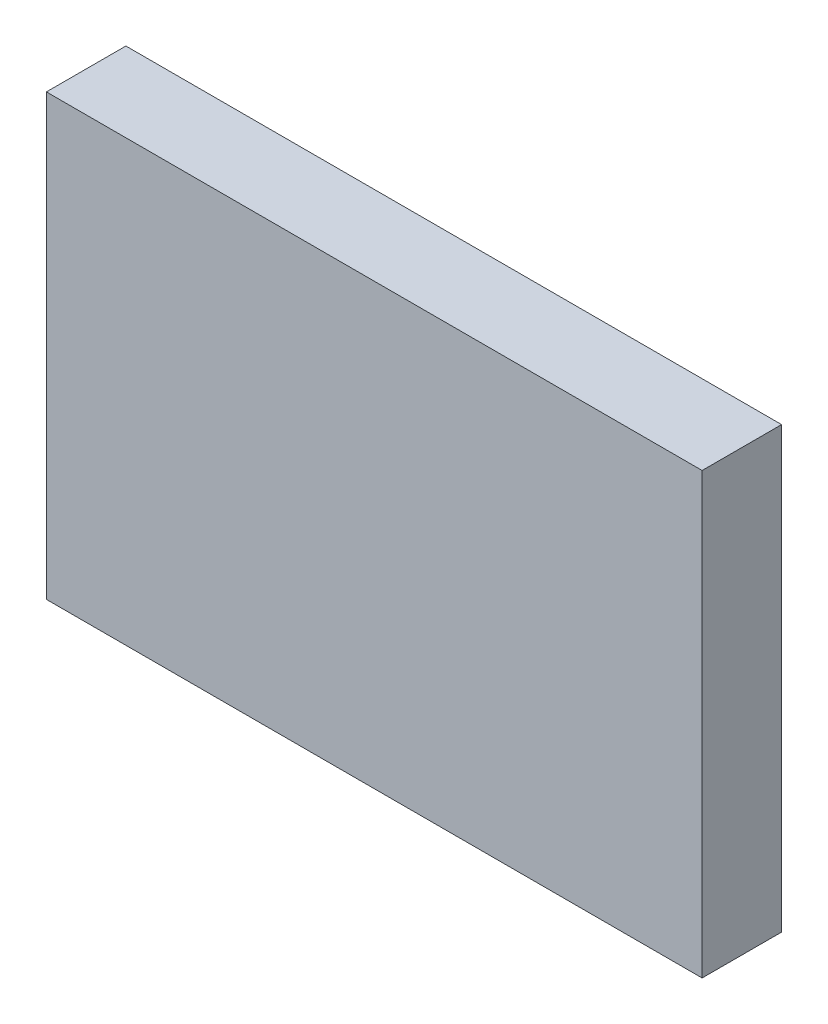
ISO-10303-21;
HEADER;
FILE_DESCRIPTION(('STEP AP214'),'2;1');
FILE_NAME('part.step','',(''),(''),'','','');
FILE_SCHEMA(('AUTOMOTIVE_DESIGN { 1 0 10303 214 1 1 1 1 }'));
ENDSEC;
DATA;
#1=APPLICATION_CONTEXT('core data for automotive mechanical design processes');
#2=APPLICATION_PROTOCOL_DEFINITION('international standard','automotive_design',2000,#1);
#3=PRODUCT_CONTEXT('',#1,'mechanical');
#4=PRODUCT('Part','Part','',(#3));
#5=PRODUCT_RELATED_PRODUCT_CATEGORY('part','',(#4));
#6=PRODUCT_DEFINITION_FORMATION('','',#4);
#7=PRODUCT_DEFINITION_CONTEXT('part definition',#1,'design');
#8=PRODUCT_DEFINITION('design','',#6,#7);
#9=PRODUCT_DEFINITION_SHAPE('','',#8);
#10=(LENGTH_UNIT() NAMED_UNIT(*) SI_UNIT(.MILLI.,.METRE.));
#11=(NAMED_UNIT(*) PLANE_ANGLE_UNIT() SI_UNIT($,.RADIAN.));
#12=(NAMED_UNIT(*) SI_UNIT($,.STERADIAN.) SOLID_ANGLE_UNIT());
#13=UNCERTAINTY_MEASURE_WITH_UNIT(LENGTH_MEASURE(1.E-05),#10,'distance_accuracy_value','');
#14=(GEOMETRIC_REPRESENTATION_CONTEXT(3) GLOBAL_UNCERTAINTY_ASSIGNED_CONTEXT((#13)) GLOBAL_UNIT_ASSIGNED_CONTEXT((#10,
#11,#12)) REPRESENTATION_CONTEXT('',''));
#15=CARTESIAN_POINT('',(0.,0.,0.));
#16=DIRECTION('',(0.,0.,1.));
#17=DIRECTION('',(1.,0.,0.));
#18=AXIS2_PLACEMENT_3D('',#15,#16,#17);
#19=CARTESIAN_POINT('',(41.25,-27.65,10.));
#20=DIRECTION('',(-1.,0.,0.));
#21=DIRECTION('',(0.,0.,1.));
#22=AXIS2_PLACEMENT_3D('',#19,#20,#21);
#23=PLANE('',#22);
#24=DIRECTION('',(0.,1.,0.));
#25=VECTOR('',#24,1.);
#26=CARTESIAN_POINT('',(41.25,-27.65,0.));
#27=LINE('',#26,#25);
#28=CARTESIAN_POINT('',(41.25,-27.65,0.));
#29=VERTEX_POINT('',#28);
#30=CARTESIAN_POINT('',(41.25,27.65,0.));
#31=VERTEX_POINT('',#30);
#32=EDGE_CURVE('E100',#29,#31,#27,.T.);
#33=ORIENTED_EDGE('',*,*,#32,.T.);
#34=DIRECTION('',(0.,0.,-1.));
#35=VECTOR('',#34,1.);
#36=CARTESIAN_POINT('',(41.25,27.65,10.));
#37=LINE('',#36,#35);
#38=CARTESIAN_POINT('',(41.25,27.65,10.));
#39=VERTEX_POINT('',#38);
#40=EDGE_CURVE('E11',#39,#31,#37,.T.);
#41=ORIENTED_EDGE('',*,*,#40,.F.);
#42=DIRECTION('',(0.,1.,0.));
#43=VECTOR('',#42,1.);
#44=CARTESIAN_POINT('',(41.25,-27.65,10.));
#45=LINE('',#44,#43);
#46=CARTESIAN_POINT('',(41.25,-27.65,10.));
#47=VERTEX_POINT('',#46);
#48=EDGE_CURVE('E88',#47,#39,#45,.T.);
#49=ORIENTED_EDGE('',*,*,#48,.F.);
#50=DIRECTION('',(0.,0.,-1.));
#51=VECTOR('',#50,1.);
#52=CARTESIAN_POINT('',(41.25,-27.65,10.));
#53=LINE('',#52,#51);
#54=EDGE_CURVE('E96',#47,#29,#53,.T.);
#55=ORIENTED_EDGE('',*,*,#54,.T.);
#56=EDGE_LOOP('',(#33,#41,#49,#55));
#57=FACE_BOUND('',#56,.T.);
#58=ADVANCED_FACE('F37',(#57),#23,.F.);
#59=CARTESIAN_POINT('',(-41.25,27.65,10.));
#60=DIRECTION('',(0.,-1.,0.));
#61=DIRECTION('',(0.,0.,-1.));
#62=AXIS2_PLACEMENT_3D('',#59,#60,#61);
#63=PLANE('',#62);
#64=DIRECTION('',(-1.,0.,0.));
#65=VECTOR('',#64,1.);
#66=CARTESIAN_POINT('',(-41.25,27.65,0.));
#67=LINE('',#66,#65);
#68=CARTESIAN_POINT('',(-41.25,27.65,0.));
#69=VERTEX_POINT('',#68);
#70=EDGE_CURVE('E92',#31,#69,#67,.T.);
#71=ORIENTED_EDGE('',*,*,#70,.T.);
#72=DIRECTION('',(0.,0.,-1.));
#73=VECTOR('',#72,1.);
#74=CARTESIAN_POINT('',(-41.25,27.65,10.));
#75=LINE('',#74,#73);
#76=CARTESIAN_POINT('',(-41.25,27.65,10.));
#77=VERTEX_POINT('',#76);
#78=EDGE_CURVE('E45',#77,#69,#75,.T.);
#79=ORIENTED_EDGE('',*,*,#78,.F.);
#80=DIRECTION('',(-1.,0.,0.));
#81=VECTOR('',#80,1.);
#82=CARTESIAN_POINT('',(-41.25,27.65,10.));
#83=LINE('',#82,#81);
#84=EDGE_CURVE('E83',#39,#77,#83,.T.);
#85=ORIENTED_EDGE('',*,*,#84,.F.);
#86=ORIENTED_EDGE('',*,*,#40,.T.);
#87=EDGE_LOOP('',(#71,#79,#85,#86));
#88=FACE_BOUND('',#87,.T.);
#89=ADVANCED_FACE('F91',(#88),#63,.F.);
#90=CARTESIAN_POINT('',(-41.25,-27.65,10.));
#91=DIRECTION('',(1.,0.,0.));
#92=DIRECTION('',(0.,0.,-1.));
#93=AXIS2_PLACEMENT_3D('',#90,#91,#92);
#94=PLANE('',#93);
#95=DIRECTION('',(0.,-1.,0.));
#96=VECTOR('',#95,1.);
#97=CARTESIAN_POINT('',(-41.25,-27.65,0.));
#98=LINE('',#97,#96);
#99=CARTESIAN_POINT('',(-41.25,-27.65,0.));
#100=VERTEX_POINT('',#99);
#101=EDGE_CURVE('E70',#69,#100,#98,.T.);
#102=ORIENTED_EDGE('',*,*,#101,.T.);
#103=DIRECTION('',(0.,0.,-1.));
#104=VECTOR('',#103,1.);
#105=CARTESIAN_POINT('',(-41.25,-27.65,10.));
#106=LINE('',#105,#104);
#107=CARTESIAN_POINT('',(-41.25,-27.65,10.));
#108=VERTEX_POINT('',#107);
#109=EDGE_CURVE('E93',#108,#100,#106,.T.);
#110=ORIENTED_EDGE('',*,*,#109,.F.);
#111=DIRECTION('',(0.,-1.,0.));
#112=VECTOR('',#111,1.);
#113=CARTESIAN_POINT('',(-41.25,-27.65,10.));
#114=LINE('',#113,#112);
#115=EDGE_CURVE('E86',#77,#108,#114,.T.);
#116=ORIENTED_EDGE('',*,*,#115,.F.);
#117=ORIENTED_EDGE('',*,*,#78,.T.);
#118=EDGE_LOOP('',(#102,#110,#116,#117));
#119=FACE_BOUND('',#118,.T.);
#120=ADVANCED_FACE('F94',(#119),#94,.F.);
#121=CARTESIAN_POINT('',(-41.25,-27.65,10.));
#122=DIRECTION('',(0.,1.,0.));
#123=DIRECTION('',(0.,0.,1.));
#124=AXIS2_PLACEMENT_3D('',#121,#122,#123);
#125=PLANE('',#124);
#126=DIRECTION('',(1.,0.,0.));
#127=VECTOR('',#126,1.);
#128=CARTESIAN_POINT('',(-41.25,-27.65,0.));
#129=LINE('',#128,#127);
#130=EDGE_CURVE('E76',#100,#29,#129,.T.);
#131=ORIENTED_EDGE('',*,*,#130,.T.);
#132=ORIENTED_EDGE('',*,*,#54,.F.);
#133=DIRECTION('',(1.,0.,0.));
#134=VECTOR('',#133,1.);
#135=CARTESIAN_POINT('',(-41.25,-27.65,10.));
#136=LINE('',#135,#134);
#137=EDGE_CURVE('E53',#108,#47,#136,.T.);
#138=ORIENTED_EDGE('',*,*,#137,.F.);
#139=ORIENTED_EDGE('',*,*,#109,.T.);
#140=EDGE_LOOP('',(#131,#132,#138,#139));
#141=FACE_BOUND('',#140,.T.);
#142=ADVANCED_FACE('F107',(#141),#125,.F.);
#143=CARTESIAN_POINT('',(0.,0.,10.));
#144=DIRECTION('',(0.,0.,-1.));
#145=DIRECTION('',(-1.,0.,0.));
#146=AXIS2_PLACEMENT_3D('',#143,#144,#145);
#147=PLANE('',#146);
#148=ORIENTED_EDGE('',*,*,#48,.T.);
#149=ORIENTED_EDGE('',*,*,#84,.T.);
#150=ORIENTED_EDGE('',*,*,#115,.T.);
#151=ORIENTED_EDGE('',*,*,#137,.T.);
#152=EDGE_LOOP('',(#148,#149,#150,#151));
#153=FACE_BOUND('',#152,.T.);
#154=ADVANCED_FACE('F84',(#153),#147,.F.);
#155=CARTESIAN_POINT('',(0.,0.,0.));
#156=DIRECTION('',(0.,0.,-1.));
#157=DIRECTION('',(-1.,0.,0.));
#158=AXIS2_PLACEMENT_3D('',#155,#156,#157);
#159=PLANE('',#158);
#160=ORIENTED_EDGE('',*,*,#32,.F.);
#161=ORIENTED_EDGE('',*,*,#130,.F.);
#162=ORIENTED_EDGE('',*,*,#101,.F.);
#163=ORIENTED_EDGE('',*,*,#70,.F.);
#164=EDGE_LOOP('',(#160,#161,#162,#163));
#165=FACE_BOUND('',#164,.T.);
#166=ADVANCED_FACE('F110',(#165),#159,.T.);
#167=CLOSED_SHELL('',(#58,#89,#120,#142,#154,#166));
#168=MANIFOLD_SOLID_BREP('B2',#167);
#169=ADVANCED_BREP_SHAPE_REPRESENTATION('',(#18,#168),#14);
#170=SHAPE_DEFINITION_REPRESENTATION(#9,#169);
ENDSEC;
END-ISO-10303-21;
